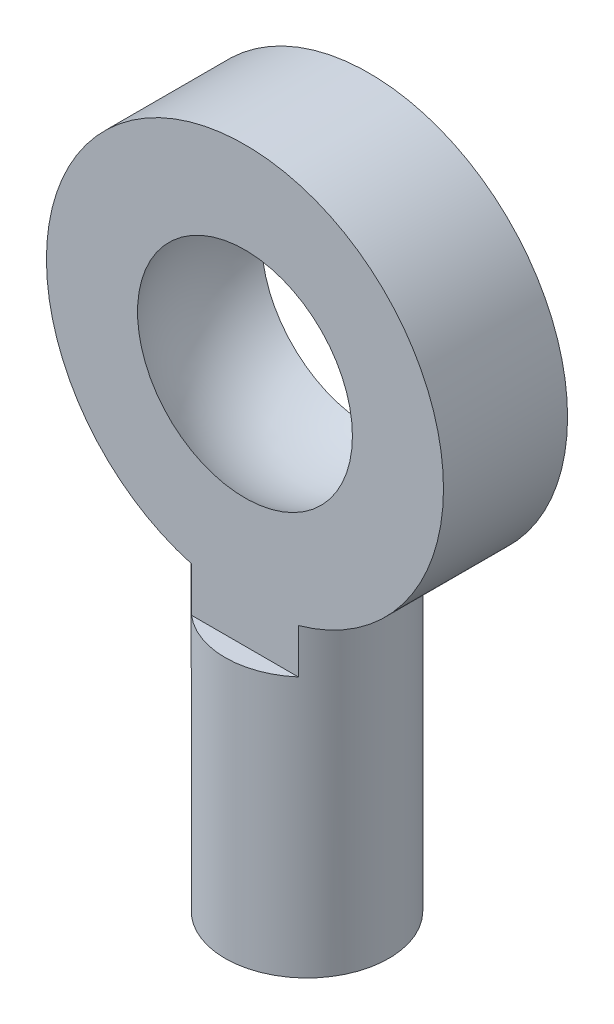
ISO-10303-21;
HEADER;
FILE_DESCRIPTION(('STEP AP214'),'2;1');
FILE_NAME('part.step','',(''),(''),'','','');
FILE_SCHEMA(('AUTOMOTIVE_DESIGN { 1 0 10303 214 1 1 1 1 }'));
ENDSEC;
DATA;
#1=APPLICATION_CONTEXT('core data for automotive mechanical design processes');
#2=APPLICATION_PROTOCOL_DEFINITION('international standard','automotive_design',2000,#1);
#3=PRODUCT_CONTEXT('',#1,'mechanical');
#4=PRODUCT('Part','Part','',(#3));
#5=PRODUCT_RELATED_PRODUCT_CATEGORY('part','',(#4));
#6=PRODUCT_DEFINITION_FORMATION('','',#4);
#7=PRODUCT_DEFINITION_CONTEXT('part definition',#1,'design');
#8=PRODUCT_DEFINITION('design','',#6,#7);
#9=PRODUCT_DEFINITION_SHAPE('','',#8);
#10=(LENGTH_UNIT() NAMED_UNIT(*) SI_UNIT(.MILLI.,.METRE.));
#11=(NAMED_UNIT(*) PLANE_ANGLE_UNIT() SI_UNIT($,.RADIAN.));
#12=(NAMED_UNIT(*) SI_UNIT($,.STERADIAN.) SOLID_ANGLE_UNIT());
#13=UNCERTAINTY_MEASURE_WITH_UNIT(LENGTH_MEASURE(1.E-05),#10,'distance_accuracy_value','');
#14=(GEOMETRIC_REPRESENTATION_CONTEXT(3) GLOBAL_UNCERTAINTY_ASSIGNED_CONTEXT((#13)) GLOBAL_UNIT_ASSIGNED_CONTEXT((#10,
#11,#12)) REPRESENTATION_CONTEXT('',''));
#15=CARTESIAN_POINT('',(0.,0.,0.));
#16=DIRECTION('',(0.,0.,1.));
#17=DIRECTION('',(1.,0.,0.));
#18=AXIS2_PLACEMENT_3D('',#15,#16,#17);
#19=CARTESIAN_POINT('',(0.,10.,0.));
#20=DIRECTION('',(0.,-1.,0.));
#21=DIRECTION('',(0.,0.,-1.));
#22=AXIS2_PLACEMENT_3D('',#19,#20,#21);
#23=CYLINDRICAL_SURFACE('',#22,1.65);
#24=CARTESIAN_POINT('',(-1.0770329614269,6.14772794314836,-1.25));
#25=CARTESIAN_POINT('',(-1.14745332238177,6.16740297615847,-1.18935953345177));
#26=CARTESIAN_POINT('',(-1.21262464395766,6.18772261672716,-1.12280762754007));
#27=CARTESIAN_POINT('',(-1.33118649591487,6.22748834213444,-0.979340043096043));
#28=CARTESIAN_POINT('',(-1.38453984754808,6.24693152105351,-0.902392850300217));
#29=CARTESIAN_POINT('',(-1.4778043135022,6.28266112973737,-0.739857414172092));
#30=CARTESIAN_POINT('',(-1.51769318524314,6.29894231741244,-0.654255173326082));
#31=CARTESIAN_POINT('',(-1.58240451829873,6.32614112807566,-0.476847958937373));
#32=CARTESIAN_POINT('',(-1.60725283370574,6.33706794880376,-0.385053932528828));
#33=CARTESIAN_POINT('',(-1.63994306828757,6.35159022972934,-0.202946002449582));
#34=CARTESIAN_POINT('',(-1.64861390441995,6.35554243192949,-0.112809999506437));
#35=CARTESIAN_POINT('',(-1.65107799197089,6.35665725599723,0.0677168818489949));
#36=CARTESIAN_POINT('',(-1.64487182038065,6.35382014118229,0.158107750240751));
#37=CARTESIAN_POINT('',(-1.61870462614695,6.34213501509136,0.330867400374586));
#38=CARTESIAN_POINT('',(-1.5995896459642,6.33365717438049,0.413392409040195));
#39=CARTESIAN_POINT('',(-1.54921733377829,6.31209136148653,0.57403587110933));
#40=CARTESIAN_POINT('',(-1.5179533272626,6.29900085553606,0.652151875201112));
#41=CARTESIAN_POINT('',(-1.44260461146008,6.26896715149315,0.80562428285379));
#42=CARTESIAN_POINT('',(-1.3980067531518,6.25187721695509,0.880698781977712));
#43=CARTESIAN_POINT('',(-1.29785048162066,6.21603450550217,1.02254944039357));
#44=CARTESIAN_POINT('',(-1.24230634163087,6.19728391132552,1.08933622344287));
#45=CARTESIAN_POINT('',(-1.14840604778819,6.16823725766134,1.18573899821918));
#46=CARTESIAN_POINT('',(-1.11341147395407,6.1578948527808,1.21866286647339));
#47=CARTESIAN_POINT('',(-1.07703296142695,6.14772794314837,1.25000000000006));
#48=B_SPLINE_CURVE_WITH_KNOTS('',3,(#24,#25,#26,#27,#28,#29,#30,#31,#32,#33,#34,#35,#36,#37,#38,
#39,#40,#41,#42,#43,#44,#45,#46,#47),.UNSPECIFIED.,.F.,.F.,(4,2,2,2,2,2,2,2,2,2,2,4),(0.,
0.284690382282611,0.570264052374097,0.856307191776514,1.14185722810881,1.41232521190574,
1.6827827060181,1.93704242507475,2.19144202895647,2.45727759228676,2.72276879001277,
2.87002502455739),.UNSPECIFIED.);
#49=CARTESIAN_POINT('',(-1.0770329614269,6.14772794314836,-1.25));
#50=VERTEX_POINT('',#49);
#51=CARTESIAN_POINT('',(-1.0770329614269,6.14772794314836,1.25));
#52=VERTEX_POINT('',#51);
#53=EDGE_CURVE('E11',#50,#52,#48,.T.);
#54=ORIENTED_EDGE('',*,*,#53,.F.);
#55=DIRECTION('',(0.,1.,0.));
#56=VECTOR('',#55,1.);
#57=CARTESIAN_POINT('',(-1.0770329614269,5.25,-1.25));
#58=LINE('',#57,#56);
#59=CARTESIAN_POINT('',(-1.0770329614269,5.25,-1.25));
#60=VERTEX_POINT('',#59);
#61=EDGE_CURVE('E60',#60,#50,#58,.T.);
#62=ORIENTED_EDGE('',*,*,#61,.F.);
#63=CARTESIAN_POINT('',(0.,5.25,0.));
#64=DIRECTION('',(0.,1.,0.));
#65=DIRECTION('',(0.,0.,1.));
#66=AXIS2_PLACEMENT_3D('',#63,#64,#65);
#67=CIRCLE('',#66,1.65);
#68=CARTESIAN_POINT('',(1.0770329614269,5.25,-1.25));
#69=VERTEX_POINT('',#68);
#70=EDGE_CURVE('E80',#69,#60,#67,.T.);
#71=ORIENTED_EDGE('',*,*,#70,.F.);
#72=DIRECTION('',(0.,1.,0.));
#73=VECTOR('',#72,1.);
#74=CARTESIAN_POINT('',(1.0770329614269,5.25,-1.25));
#75=LINE('',#74,#73);
#76=CARTESIAN_POINT('',(1.0770329614269,6.14772794314836,-1.25));
#77=VERTEX_POINT('',#76);
#78=EDGE_CURVE('E52',#69,#77,#75,.T.);
#79=ORIENTED_EDGE('',*,*,#78,.T.);
#80=CARTESIAN_POINT('',(1.0770329614269,6.14772794314836,1.25));
#81=CARTESIAN_POINT('',(1.14745332238177,6.16740297615847,1.18935953345177));
#82=CARTESIAN_POINT('',(1.21262464395766,6.18772261672716,1.12280762754007));
#83=CARTESIAN_POINT('',(1.33118649591487,6.22748834213444,0.979340043096043));
#84=CARTESIAN_POINT('',(1.38453984754808,6.24693152105351,0.902392850300217));
#85=CARTESIAN_POINT('',(1.4778043135022,6.28266112973737,0.739857414172092));
#86=CARTESIAN_POINT('',(1.51769318524314,6.29894231741244,0.654255173326082));
#87=CARTESIAN_POINT('',(1.58240451829873,6.32614112807566,0.476847958937373));
#88=CARTESIAN_POINT('',(1.60725283370574,6.33706794880376,0.385053932528828));
#89=CARTESIAN_POINT('',(1.63994306828757,6.35159022972934,0.202946002449582));
#90=CARTESIAN_POINT('',(1.64861390441995,6.35554243192949,0.112809999506437));
#91=CARTESIAN_POINT('',(1.65107799197089,6.35665725599723,-0.0677168818489948));
#92=CARTESIAN_POINT('',(1.64487182038065,6.35382014118229,-0.158107750240751));
#93=CARTESIAN_POINT('',(1.61870462614695,6.34213501509136,-0.330867400374586));
#94=CARTESIAN_POINT('',(1.5995896459642,6.33365717438049,-0.413392409040195));
#95=CARTESIAN_POINT('',(1.54921733377829,6.31209136148653,-0.574035871109331));
#96=CARTESIAN_POINT('',(1.5179533272626,6.29900085553606,-0.652151875201113));
#97=CARTESIAN_POINT('',(1.44260461146008,6.26896715149315,-0.80562428285379));
#98=CARTESIAN_POINT('',(1.3980067531518,6.25187721695509,-0.880698781977712));
#99=CARTESIAN_POINT('',(1.29785048162066,6.21603450550217,-1.02254944039357));
#100=CARTESIAN_POINT('',(1.24230634163087,6.19728391132552,-1.08933622344287));
#101=CARTESIAN_POINT('',(1.14840604778819,6.16823725766134,-1.18573899821918));
#102=CARTESIAN_POINT('',(1.11341147395407,6.1578948527808,-1.21866286647339));
#103=CARTESIAN_POINT('',(1.07703296142695,6.14772794314837,-1.25000000000006));
#104=B_SPLINE_CURVE_WITH_KNOTS('',3,(#80,#81,#82,#83,#84,#85,#86,#87,#88,#89,#90,#91,#92,#93,
#94,#95,#96,#97,#98,#99,#100,#101,#102,#103),.UNSPECIFIED.,.F.,.F.,(4,2,2,2,2,2,2,2,2,2,2,4),
(0.,0.284690382282611,0.570264052374097,0.856307191776514,1.14185722810881,1.41232521190574,
1.6827827060181,1.93704242507475,2.19144202895647,2.45727759228676,2.72276879001277,
2.87002502455739),.UNSPECIFIED.);
#105=CARTESIAN_POINT('',(1.0770329614269,6.14772794314836,1.25));
#106=VERTEX_POINT('',#105);
#107=EDGE_CURVE('E45',#106,#77,#104,.T.);
#108=ORIENTED_EDGE('',*,*,#107,.F.);
#109=DIRECTION('',(0.,1.,0.));
#110=VECTOR('',#109,1.);
#111=CARTESIAN_POINT('',(1.0770329614269,5.25,1.25));
#112=LINE('',#111,#110);
#113=CARTESIAN_POINT('',(1.0770329614269,5.25,1.25));
#114=VERTEX_POINT('',#113);
#115=EDGE_CURVE('E99',#114,#106,#112,.T.);
#116=ORIENTED_EDGE('',*,*,#115,.F.);
#117=CARTESIAN_POINT('',(0.,5.25,0.));
#118=DIRECTION('',(0.,1.,0.));
#119=DIRECTION('',(0.,0.,1.));
#120=AXIS2_PLACEMENT_3D('',#117,#118,#119);
#121=CIRCLE('',#120,1.65);
#122=CARTESIAN_POINT('',(-1.0770329614269,5.25,1.25));
#123=VERTEX_POINT('',#122);
#124=EDGE_CURVE('E93',#123,#114,#121,.T.);
#125=ORIENTED_EDGE('',*,*,#124,.F.);
#126=DIRECTION('',(0.,1.,0.));
#127=VECTOR('',#126,1.);
#128=CARTESIAN_POINT('',(-1.0770329614269,5.25,1.25));
#129=LINE('',#128,#127);
#130=EDGE_CURVE('E83',#123,#52,#129,.T.);
#131=ORIENTED_EDGE('',*,*,#130,.T.);
#132=EDGE_LOOP('',(#54,#62,#71,#79,#108,#116,#125,#131));
#133=FACE_BOUND('',#132,.T.);
#134=CARTESIAN_POINT('',(0.,0.,0.));
#135=DIRECTION('',(0.,1.,0.));
#136=DIRECTION('',(0.,0.,1.));
#137=AXIS2_PLACEMENT_3D('',#134,#135,#136);
#138=CIRCLE('',#137,1.65);
#139=CARTESIAN_POINT('',(0.,0.,1.65));
#140=VERTEX_POINT('',#139);
#141=EDGE_CURVE('E105',#140,#140,#138,.T.);
#142=ORIENTED_EDGE('',*,*,#141,.T.);
#143=EDGE_LOOP('',(#142));
#144=FACE_BOUND('',#143,.T.);
#145=ADVANCED_FACE('F36',(#133,#144),#23,.T.);
#146=CARTESIAN_POINT('',(0.,0.,0.));
#147=DIRECTION('',(0.,1.,0.));
#148=DIRECTION('',(0.,0.,1.));
#149=AXIS2_PLACEMENT_3D('',#146,#147,#148);
#150=PLANE('',#149);
#151=CARTESIAN_POINT('',(0.,0.,0.));
#152=DIRECTION('',(0.,-1.,0.));
#153=DIRECTION('',(0.,0.,-1.));
#154=AXIS2_PLACEMENT_3D('',#151,#152,#153);
#155=CIRCLE('',#154,1.1);
#156=CARTESIAN_POINT('',(0.,0.,-1.1));
#157=VERTEX_POINT('',#156);
#158=EDGE_CURVE('E135',#157,#157,#155,.T.);
#159=ORIENTED_EDGE('',*,*,#158,.F.);
#160=EDGE_LOOP('',(#159));
#161=FACE_BOUND('',#160,.T.);
#162=ORIENTED_EDGE('',*,*,#141,.F.);
#163=EDGE_LOOP('',(#162));
#164=FACE_BOUND('',#163,.T.);
#165=ADVANCED_FACE('F123',(#161,#164),#150,.F.);
#166=CARTESIAN_POINT('',(0.,10.,1.25));
#167=DIRECTION('',(0.,0.,-1.));
#168=DIRECTION('',(-1.,0.,0.));
#169=AXIS2_PLACEMENT_3D('',#166,#167,#168);
#170=CYLINDRICAL_SURFACE('',#169,4.);
#171=CARTESIAN_POINT('',(0.,10.,1.25));
#172=DIRECTION('',(0.,0.,1.));
#173=DIRECTION('',(1.,0.,0.));
#174=AXIS2_PLACEMENT_3D('',#171,#172,#173);
#175=CIRCLE('',#174,4.);
#176=EDGE_CURVE('E102',#106,#52,#175,.T.);
#177=ORIENTED_EDGE('',*,*,#176,.F.);
#178=ORIENTED_EDGE('',*,*,#107,.T.);
#179=CARTESIAN_POINT('',(0.,10.,-1.25));
#180=DIRECTION('',(0.,0.,1.));
#181=DIRECTION('',(1.,0.,0.));
#182=AXIS2_PLACEMENT_3D('',#179,#180,#181);
#183=CIRCLE('',#182,4.);
#184=EDGE_CURVE('E90',#77,#50,#183,.T.);
#185=ORIENTED_EDGE('',*,*,#184,.T.);
#186=ORIENTED_EDGE('',*,*,#53,.T.);
#187=EDGE_LOOP('',(#177,#178,#185,#186));
#188=FACE_BOUND('',#187,.T.);
#189=ADVANCED_FACE('F118',(#188),#170,.T.);
#190=CARTESIAN_POINT('',(0.,10.,1.25));
#191=DIRECTION('',(0.,0.,1.));
#192=DIRECTION('',(1.,0.,0.));
#193=AXIS2_PLACEMENT_3D('',#190,#191,#192);
#194=PLANE('',#193);
#195=CARTESIAN_POINT('',(0.,10.,1.25));
#196=DIRECTION('',(0.,0.,1.));
#197=DIRECTION('',(1.,0.,0.));
#198=AXIS2_PLACEMENT_3D('',#195,#196,#197);
#199=CIRCLE('',#198,2.1650635094611);
#200=CARTESIAN_POINT('',(2.1650635094611,10.,1.25));
#201=VERTEX_POINT('',#200);
#202=EDGE_CURVE('E138',#201,#201,#199,.F.);
#203=ORIENTED_EDGE('',*,*,#202,.T.);
#204=EDGE_LOOP('',(#203));
#205=FACE_BOUND('',#204,.T.);
#206=ORIENTED_EDGE('',*,*,#176,.T.);
#207=ORIENTED_EDGE('',*,*,#130,.F.);
#208=DIRECTION('',(-1.,0.,0.));
#209=VECTOR('',#208,1.);
#210=CARTESIAN_POINT('',(1.0770329614269,5.25,1.25));
#211=LINE('',#210,#209);
#212=EDGE_CURVE('E95',#114,#123,#211,.T.);
#213=ORIENTED_EDGE('',*,*,#212,.F.);
#214=ORIENTED_EDGE('',*,*,#115,.T.);
#215=EDGE_LOOP('',(#206,#207,#213,#214));
#216=FACE_BOUND('',#215,.T.);
#217=ADVANCED_FACE('F122',(#205,#216),#194,.T.);
#218=CARTESIAN_POINT('',(0.,10.,-1.25));
#219=DIRECTION('',(0.,0.,1.));
#220=DIRECTION('',(1.,0.,0.));
#221=AXIS2_PLACEMENT_3D('',#218,#219,#220);
#222=PLANE('',#221);
#223=CARTESIAN_POINT('',(0.,10.,-1.25));
#224=DIRECTION('',(0.,0.,1.));
#225=DIRECTION('',(1.,0.,0.));
#226=AXIS2_PLACEMENT_3D('',#223,#224,#225);
#227=CIRCLE('',#226,2.1650635094611);
#228=CARTESIAN_POINT('',(2.1650635094611,10.,-1.25));
#229=VERTEX_POINT('',#228);
#230=EDGE_CURVE('E40',#229,#229,#227,.F.);
#231=ORIENTED_EDGE('',*,*,#230,.F.);
#232=EDGE_LOOP('',(#231));
#233=FACE_BOUND('',#232,.T.);
#234=ORIENTED_EDGE('',*,*,#61,.T.);
#235=ORIENTED_EDGE('',*,*,#184,.F.);
#236=ORIENTED_EDGE('',*,*,#78,.F.);
#237=DIRECTION('',(1.,0.,0.));
#238=VECTOR('',#237,1.);
#239=CARTESIAN_POINT('',(-1.0770329614269,5.25,-1.25));
#240=LINE('',#239,#238);
#241=EDGE_CURVE('E82',#60,#69,#240,.T.);
#242=ORIENTED_EDGE('',*,*,#241,.F.);
#243=EDGE_LOOP('',(#234,#235,#236,#242));
#244=FACE_BOUND('',#243,.T.);
#245=ADVANCED_FACE('F85',(#233,#244),#222,.F.);
#246=CARTESIAN_POINT('',(0.,5.25,0.));
#247=DIRECTION('',(0.,1.,0.));
#248=DIRECTION('',(0.,0.,1.));
#249=AXIS2_PLACEMENT_3D('',#246,#247,#248);
#250=PLANE('',#249);
#251=ORIENTED_EDGE('',*,*,#124,.T.);
#252=ORIENTED_EDGE('',*,*,#212,.T.);
#253=EDGE_LOOP('',(#251,#252));
#254=FACE_BOUND('',#253,.T.);
#255=ADVANCED_FACE('F152',(#254),#250,.T.);
#256=CARTESIAN_POINT('',(0.,5.25,0.));
#257=DIRECTION('',(0.,1.,0.));
#258=DIRECTION('',(0.,0.,1.));
#259=AXIS2_PLACEMENT_3D('',#256,#257,#258);
#260=PLANE('',#259);
#261=ORIENTED_EDGE('',*,*,#70,.T.);
#262=ORIENTED_EDGE('',*,*,#241,.T.);
#263=EDGE_LOOP('',(#261,#262));
#264=FACE_BOUND('',#263,.T.);
#265=ADVANCED_FACE('F81',(#264),#260,.T.);
#266=CARTESIAN_POINT('',(0.,5.,0.));
#267=DIRECTION('',(0.,-1.,0.));
#268=DIRECTION('',(0.,0.,-1.));
#269=AXIS2_PLACEMENT_3D('',#266,#267,#268);
#270=CYLINDRICAL_SURFACE('',#269,1.1);
#271=CARTESIAN_POINT('',(0.,5.,0.));
#272=DIRECTION('',(0.,-1.,0.));
#273=DIRECTION('',(0.,0.,-1.));
#274=AXIS2_PLACEMENT_3D('',#271,#272,#273);
#275=CIRCLE('',#274,1.1);
#276=CARTESIAN_POINT('',(0.,5.,-1.1));
#277=VERTEX_POINT('',#276);
#278=EDGE_CURVE('E96',#277,#277,#275,.T.);
#279=ORIENTED_EDGE('',*,*,#278,.F.);
#280=EDGE_LOOP('',(#279));
#281=FACE_BOUND('',#280,.T.);
#282=ORIENTED_EDGE('',*,*,#158,.T.);
#283=EDGE_LOOP('',(#282));
#284=FACE_BOUND('',#283,.T.);
#285=ADVANCED_FACE('F165',(#281,#284),#270,.F.);
#286=CARTESIAN_POINT('',(0.,5.,0.));
#287=DIRECTION('',(0.,-1.,0.));
#288=DIRECTION('',(0.,0.,-1.));
#289=AXIS2_PLACEMENT_3D('',#286,#287,#288);
#290=PLANE('',#289);
#291=ORIENTED_EDGE('',*,*,#278,.T.);
#292=EDGE_LOOP('',(#291));
#293=FACE_BOUND('',#292,.T.);
#294=ADVANCED_FACE('F168',(#293),#290,.T.);
#295=CARTESIAN_POINT('',(0.,10.,0.));
#296=DIRECTION('',(0.,1.,0.));
#297=DIRECTION('',(1.,0.,0.));
#298=AXIS2_PLACEMENT_3D('',#295,#296,#297);
#299=SPHERICAL_SURFACE('',#298,2.5);
#300=CARTESIAN_POINT('',(0.,10.,0.));
#301=DIRECTION('',(0.,0.,1.));
#302=DIRECTION('',(1.,0.,0.));
#303=AXIS2_PLACEMENT_3D('',#300,#301,#302);
#304=SPHERICAL_SURFACE('',#303,2.5);
#305=ORIENTED_EDGE('',*,*,#202,.F.);
#306=EDGE_LOOP('',(#305));
#307=FACE_BOUND('',#306,.T.);
#308=ORIENTED_EDGE('',*,*,#230,.T.);
#309=EDGE_LOOP('',(#308));
#310=FACE_BOUND('',#309,.T.);
#311=ADVANCED_FACE('F149',(#307,#310),#304,.F.);
#312=CLOSED_SHELL('',(#145,#165,#189,#217,#245,#255,#265,#285,#294,#311));
#313=MANIFOLD_SOLID_BREP('B2',#312);
#314=ADVANCED_BREP_SHAPE_REPRESENTATION('',(#18,#313),#14);
#315=SHAPE_DEFINITION_REPRESENTATION(#9,#314);
ENDSEC;
END-ISO-10303-21;
